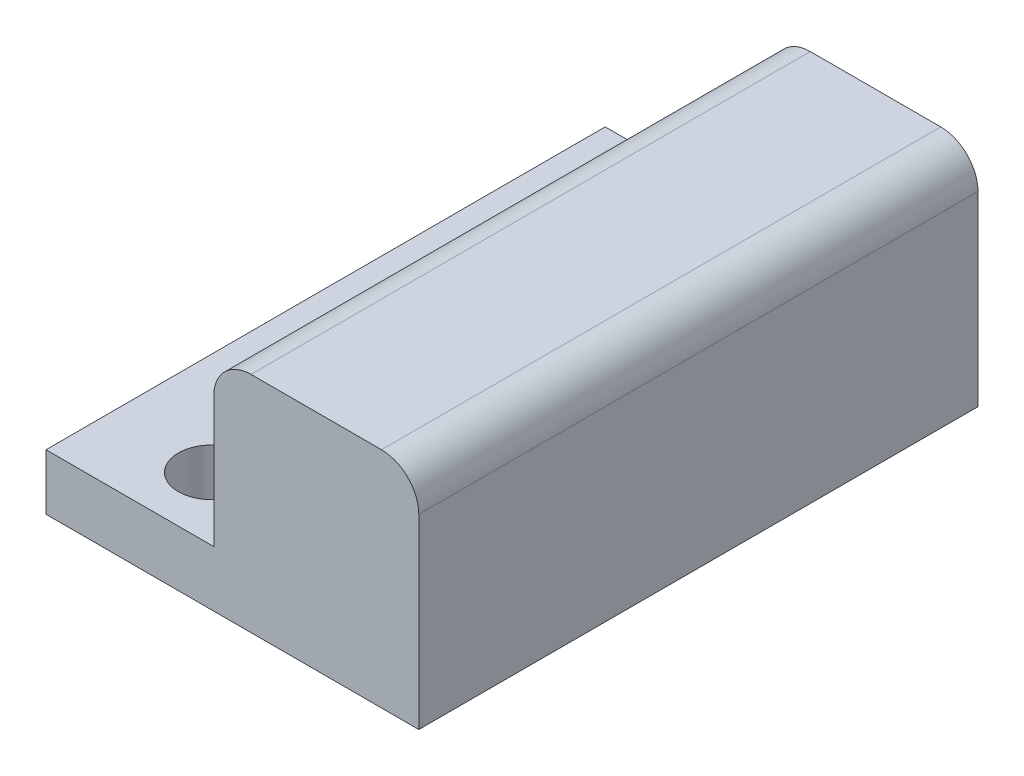
ISO-10303-21;
HEADER;
FILE_DESCRIPTION(('STEP AP214'),'2;1');
FILE_NAME('part.step','',(''),(''),'','','');
FILE_SCHEMA(('AUTOMOTIVE_DESIGN { 1 0 10303 214 1 1 1 1 }'));
ENDSEC;
DATA;
#1=APPLICATION_CONTEXT('core data for automotive mechanical design processes');
#2=APPLICATION_PROTOCOL_DEFINITION('international standard','automotive_design',2000,#1);
#3=PRODUCT_CONTEXT('',#1,'mechanical');
#4=PRODUCT('Part','Part','',(#3));
#5=PRODUCT_RELATED_PRODUCT_CATEGORY('part','',(#4));
#6=PRODUCT_DEFINITION_FORMATION('','',#4);
#7=PRODUCT_DEFINITION_CONTEXT('part definition',#1,'design');
#8=PRODUCT_DEFINITION('design','',#6,#7);
#9=PRODUCT_DEFINITION_SHAPE('','',#8);
#10=(LENGTH_UNIT() NAMED_UNIT(*) SI_UNIT(.MILLI.,.METRE.));
#11=(NAMED_UNIT(*) PLANE_ANGLE_UNIT() SI_UNIT($,.RADIAN.));
#12=(NAMED_UNIT(*) SI_UNIT($,.STERADIAN.) SOLID_ANGLE_UNIT());
#13=UNCERTAINTY_MEASURE_WITH_UNIT(LENGTH_MEASURE(1.E-05),#10,'distance_accuracy_value','');
#14=(GEOMETRIC_REPRESENTATION_CONTEXT(3) GLOBAL_UNCERTAINTY_ASSIGNED_CONTEXT((#13)) GLOBAL_UNIT_ASSIGNED_CONTEXT((#10,
#11,#12)) REPRESENTATION_CONTEXT('',''));
#15=CARTESIAN_POINT('',(0.,0.,0.));
#16=DIRECTION('',(0.,0.,1.));
#17=DIRECTION('',(1.,0.,0.));
#18=AXIS2_PLACEMENT_3D('',#15,#16,#17);
#19=CARTESIAN_POINT('',(10.8430993489864,3.81,0.));
#20=DIRECTION('',(0.,1.,0.));
#21=DIRECTION('',(0.,0.,1.));
#22=AXIS2_PLACEMENT_3D('',#19,#20,#21);
#23=PLANE('',#22);
#24=DIRECTION('',(0.,0.,-1.));
#25=VECTOR('',#24,1.);
#26=CARTESIAN_POINT('',(28.2815496744932,3.81,28.9331090883262));
#27=LINE('',#26,#25);
#28=CARTESIAN_POINT('',(28.2815496744932,3.81,28.9331090883262));
#29=VERTEX_POINT('',#28);
#30=CARTESIAN_POINT('',(28.2815496744932,3.81,-6.62689091167376));
#31=VERTEX_POINT('',#30);
#32=EDGE_CURVE('E197',#29,#31,#27,.T.);
#33=ORIENTED_EDGE('',*,*,#32,.T.);
#34=DIRECTION('',(1.,0.,0.));
#35=VECTOR('',#34,1.);
#36=CARTESIAN_POINT('',(30.8215496744932,3.81,-6.62689091167376));
#37=LINE('',#36,#35);
#38=CARTESIAN_POINT('',(19.3915496744932,3.81,-6.62689091167376));
#39=VERTEX_POINT('',#38);
#40=EDGE_CURVE('E172',#39,#31,#37,.T.);
#41=ORIENTED_EDGE('',*,*,#40,.F.);
#42=DIRECTION('',(0.,0.,1.));
#43=VECTOR('',#42,1.);
#44=CARTESIAN_POINT('',(19.3915496744932,3.81,-6.62689091167376));
#45=LINE('',#44,#43);
#46=CARTESIAN_POINT('',(19.3915496744932,3.81,28.9331090883262));
#47=VERTEX_POINT('',#46);
#48=EDGE_CURVE('E180',#39,#47,#45,.T.);
#49=ORIENTED_EDGE('',*,*,#48,.T.);
#50=DIRECTION('',(1.,0.,0.));
#51=VECTOR('',#50,1.);
#52=CARTESIAN_POINT('',(19.3915496744932,3.81,28.9331090883262));
#53=LINE('',#52,#51);
#54=EDGE_CURVE('E186',#47,#29,#53,.T.);
#55=ORIENTED_EDGE('',*,*,#54,.T.);
#56=EDGE_LOOP('',(#33,#41,#49,#55));
#57=FACE_BOUND('',#56,.T.);
#58=ADVANCED_FACE('F45',(#57),#23,.T.);
#59=DIRECTION('',(0.,0.,-1.));
#60=VECTOR('',#59,1.);
#61=CARTESIAN_POINT('',(16.8515496744932,3.81,31.4731090883262));
#62=LINE('',#61,#60);
#63=CARTESIAN_POINT('',(16.8515496744932,3.81,31.4731090883262));
#64=VERTEX_POINT('',#63);
#65=CARTESIAN_POINT('',(16.8515496744932,3.81,-6.62689091167376));
#66=VERTEX_POINT('',#65);
#67=EDGE_CURVE('E153',#64,#66,#62,.T.);
#68=ORIENTED_EDGE('',*,*,#67,.T.);
#69=CARTESIAN_POINT('',(5.42154967449321,3.81,-6.62689091167375));
#70=VERTEX_POINT('',#69);
#71=EDGE_CURVE('E161',#70,#66,#37,.T.);
#72=ORIENTED_EDGE('',*,*,#71,.F.);
#73=DIRECTION('',(0.,0.,-1.));
#74=VECTOR('',#73,1.);
#75=CARTESIAN_POINT('',(5.42154967449321,3.81,-6.62689091167375));
#76=LINE('',#75,#74);
#77=CARTESIAN_POINT('',(5.42154967449322,3.81,31.4731090883262));
#78=VERTEX_POINT('',#77);
#79=EDGE_CURVE('E233',#78,#70,#76,.T.);
#80=ORIENTED_EDGE('',*,*,#79,.F.);
#81=DIRECTION('',(-1.,0.,0.));
#82=VECTOR('',#81,1.);
#83=CARTESIAN_POINT('',(30.8215496744932,3.81,31.4731090883262));
#84=LINE('',#83,#82);
#85=EDGE_CURVE('E178',#64,#78,#84,.T.);
#86=ORIENTED_EDGE('',*,*,#85,.F.);
#87=EDGE_LOOP('',(#68,#72,#80,#86));
#88=FACE_BOUND('',#87,.T.);
#89=CARTESIAN_POINT('',(9.23154967449321,3.81,-1.41989091167375));
#90=DIRECTION('',(0.,-1.,0.));
#91=DIRECTION('',(0.,0.,1.));
#92=AXIS2_PLACEMENT_3D('',#89,#90,#91);
#93=CIRCLE('',#92,2.286);
#94=CARTESIAN_POINT('',(9.23154967449321,3.81,-3.70589091167375));
#95=VERTEX_POINT('',#94);
#96=EDGE_CURVE('E223',#95,#95,#93,.T.);
#97=ORIENTED_EDGE('',*,*,#96,.T.);
#98=EDGE_LOOP('',(#97));
#99=FACE_BOUND('',#98,.T.);
#100=CARTESIAN_POINT('',(12.4065496744932,3.81,27.1551090883262));
#101=DIRECTION('',(0.,-1.,0.));
#102=DIRECTION('',(0.,0.,1.));
#103=AXIS2_PLACEMENT_3D('',#100,#101,#102);
#104=CIRCLE('',#103,2.286);
#105=CARTESIAN_POINT('',(12.4065496744932,3.81,24.8691090883262));
#106=VERTEX_POINT('',#105);
#107=EDGE_CURVE('E215',#106,#106,#104,.T.);
#108=ORIENTED_EDGE('',*,*,#107,.T.);
#109=EDGE_LOOP('',(#108));
#110=FACE_BOUND('',#109,.T.);
#111=ADVANCED_FACE('F175',(#88,#99,#110),#23,.T.);
#112=CARTESIAN_POINT('',(10.8430993489864,0.,0.));
#113=DIRECTION('',(0.,1.,0.));
#114=DIRECTION('',(0.,0.,1.));
#115=AXIS2_PLACEMENT_3D('',#112,#113,#114);
#116=PLANE('',#115);
#117=DIRECTION('',(0.,0.,1.));
#118=VECTOR('',#117,1.);
#119=CARTESIAN_POINT('',(30.8215496744932,0.,-6.62689091167376));
#120=LINE('',#119,#118);
#121=CARTESIAN_POINT('',(30.8215496744932,0.,-6.62689091167376));
#122=VERTEX_POINT('',#121);
#123=CARTESIAN_POINT('',(30.8215496744932,0.,31.4731090883262));
#124=VERTEX_POINT('',#123);
#125=EDGE_CURVE('E227',#122,#124,#120,.T.);
#126=ORIENTED_EDGE('',*,*,#125,.T.);
#127=DIRECTION('',(-1.,0.,0.));
#128=VECTOR('',#127,1.);
#129=CARTESIAN_POINT('',(30.8215496744932,0.,31.4731090883262));
#130=LINE('',#129,#128);
#131=CARTESIAN_POINT('',(5.42154967449322,0.,31.4731090883262));
#132=VERTEX_POINT('',#131);
#133=EDGE_CURVE('E240',#124,#132,#130,.T.);
#134=ORIENTED_EDGE('',*,*,#133,.T.);
#135=DIRECTION('',(0.,0.,-1.));
#136=VECTOR('',#135,1.);
#137=CARTESIAN_POINT('',(5.42154967449321,0.,-6.62689091167375));
#138=LINE('',#137,#136);
#139=CARTESIAN_POINT('',(5.42154967449321,0.,-6.62689091167375));
#140=VERTEX_POINT('',#139);
#141=EDGE_CURVE('E244',#132,#140,#138,.T.);
#142=ORIENTED_EDGE('',*,*,#141,.T.);
#143=DIRECTION('',(1.,0.,0.));
#144=VECTOR('',#143,1.);
#145=CARTESIAN_POINT('',(30.8215496744932,0.,-6.62689091167376));
#146=LINE('',#145,#144);
#147=EDGE_CURVE('E234',#140,#122,#146,.T.);
#148=ORIENTED_EDGE('',*,*,#147,.T.);
#149=EDGE_LOOP('',(#126,#134,#142,#148));
#150=FACE_BOUND('',#149,.T.);
#151=CARTESIAN_POINT('',(9.23154967449321,0.,-1.41989091167375));
#152=DIRECTION('',(0.,-1.,0.));
#153=DIRECTION('',(0.,0.,1.));
#154=AXIS2_PLACEMENT_3D('',#151,#152,#153);
#155=CIRCLE('',#154,2.286);
#156=CARTESIAN_POINT('',(9.23154967449321,0.,-3.70589091167375));
#157=VERTEX_POINT('',#156);
#158=EDGE_CURVE('E219',#157,#157,#155,.T.);
#159=ORIENTED_EDGE('',*,*,#158,.F.);
#160=EDGE_LOOP('',(#159));
#161=FACE_BOUND('',#160,.T.);
#162=CARTESIAN_POINT('',(12.4065496744932,0.,27.1551090883262));
#163=DIRECTION('',(0.,-1.,0.));
#164=DIRECTION('',(0.,0.,1.));
#165=AXIS2_PLACEMENT_3D('',#162,#163,#164);
#166=CIRCLE('',#165,2.286);
#167=CARTESIAN_POINT('',(12.4065496744932,0.,24.8691090883262));
#168=VERTEX_POINT('',#167);
#169=EDGE_CURVE('E214',#168,#168,#166,.T.);
#170=ORIENTED_EDGE('',*,*,#169,.F.);
#171=EDGE_LOOP('',(#170));
#172=FACE_BOUND('',#171,.T.);
#173=ADVANCED_FACE('F364',(#150,#161,#172),#116,.F.);
#174=CARTESIAN_POINT('',(30.8215496744932,3.81,-6.62689091167376));
#175=DIRECTION('',(-1.,0.,0.));
#176=DIRECTION('',(0.,0.,-1.));
#177=AXIS2_PLACEMENT_3D('',#174,#175,#176);
#178=PLANE('',#177);
#179=DIRECTION('',(0.,-1.,0.));
#180=VECTOR('',#179,1.);
#181=CARTESIAN_POINT('',(30.8215496744932,3.81,31.4731090883262));
#182=LINE('',#181,#180);
#183=CARTESIAN_POINT('',(30.8215496744932,12.7,31.4731090883262));
#184=VERTEX_POINT('',#183);
#185=EDGE_CURVE('E258',#184,#124,#182,.T.);
#186=ORIENTED_EDGE('',*,*,#185,.T.);
#187=ORIENTED_EDGE('',*,*,#125,.F.);
#188=DIRECTION('',(0.,-1.,0.));
#189=VECTOR('',#188,1.);
#190=CARTESIAN_POINT('',(30.8215496744932,3.81,-6.62689091167376));
#191=LINE('',#190,#189);
#192=CARTESIAN_POINT('',(30.8215496744932,12.7,-6.62689091167376));
#193=VERTEX_POINT('',#192);
#194=EDGE_CURVE('E171',#193,#122,#191,.T.);
#195=ORIENTED_EDGE('',*,*,#194,.F.);
#196=DIRECTION('',(0.,0.,1.));
#197=VECTOR('',#196,1.);
#198=CARTESIAN_POINT('',(30.8215496744932,12.7,-6.62689091167376));
#199=LINE('',#198,#197);
#200=EDGE_CURVE('E11',#184,#193,#199,.F.);
#201=ORIENTED_EDGE('',*,*,#200,.F.);
#202=EDGE_LOOP('',(#186,#187,#195,#201));
#203=FACE_BOUND('',#202,.T.);
#204=ADVANCED_FACE('F371',(#203),#178,.F.);
#205=CARTESIAN_POINT('',(30.8215496744932,3.81,31.4731090883262));
#206=DIRECTION('',(0.,0.,-1.));
#207=DIRECTION('',(1.,0.,0.));
#208=AXIS2_PLACEMENT_3D('',#205,#206,#207);
#209=PLANE('',#208);
#210=DIRECTION('',(0.,-1.,0.));
#211=VECTOR('',#210,1.);
#212=CARTESIAN_POINT('',(16.8515496744932,12.7,31.4731090883262));
#213=LINE('',#212,#211);
#214=CARTESIAN_POINT('',(16.8515496744932,12.7,31.4731090883262));
#215=VERTEX_POINT('',#214);
#216=EDGE_CURVE('E157',#215,#64,#213,.T.);
#217=ORIENTED_EDGE('',*,*,#216,.T.);
#218=ORIENTED_EDGE('',*,*,#85,.T.);
#219=DIRECTION('',(0.,-1.,0.));
#220=VECTOR('',#219,1.);
#221=CARTESIAN_POINT('',(5.42154967449322,3.81,31.4731090883262));
#222=LINE('',#221,#220);
#223=EDGE_CURVE('E255',#78,#132,#222,.T.);
#224=ORIENTED_EDGE('',*,*,#223,.T.);
#225=ORIENTED_EDGE('',*,*,#133,.F.);
#226=ORIENTED_EDGE('',*,*,#185,.F.);
#227=CARTESIAN_POINT('',(28.2815496744932,12.7,31.4731090883262));
#228=DIRECTION('',(0.,0.,1.));
#229=DIRECTION('',(1.,0.,0.));
#230=AXIS2_PLACEMENT_3D('',#227,#228,#229);
#231=CIRCLE('',#230,2.54);
#232=CARTESIAN_POINT('',(28.2815496744932,15.24,31.4731090883262));
#233=VERTEX_POINT('',#232);
#234=EDGE_CURVE('E60',#233,#184,#231,.F.);
#235=ORIENTED_EDGE('',*,*,#234,.F.);
#236=DIRECTION('',(-1.,0.,0.));
#237=VECTOR('',#236,1.);
#238=CARTESIAN_POINT('',(30.8215496744932,15.24,31.4731090883262));
#239=LINE('',#238,#237);
#240=CARTESIAN_POINT('',(19.3915496744932,15.24,31.4731090883262));
#241=VERTEX_POINT('',#240);
#242=EDGE_CURVE('E188',#233,#241,#239,.T.);
#243=ORIENTED_EDGE('',*,*,#242,.T.);
#244=CARTESIAN_POINT('',(19.3915496744932,12.7,31.4731090883262));
#245=DIRECTION('',(0.,0.,1.));
#246=DIRECTION('',(1.,0.,0.));
#247=AXIS2_PLACEMENT_3D('',#244,#245,#246);
#248=CIRCLE('',#247,2.54);
#249=EDGE_CURVE('E54',#215,#241,#248,.F.);
#250=ORIENTED_EDGE('',*,*,#249,.F.);
#251=EDGE_LOOP('',(#217,#218,#224,#225,#226,#235,#243,#250));
#252=FACE_BOUND('',#251,.T.);
#253=ADVANCED_FACE('F309',(#252),#209,.F.);
#254=CARTESIAN_POINT('',(5.42154967449321,3.81,-6.62689091167375));
#255=DIRECTION('',(1.,0.,0.));
#256=DIRECTION('',(0.,0.,1.));
#257=AXIS2_PLACEMENT_3D('',#254,#255,#256);
#258=PLANE('',#257);
#259=ORIENTED_EDGE('',*,*,#141,.F.);
#260=ORIENTED_EDGE('',*,*,#223,.F.);
#261=ORIENTED_EDGE('',*,*,#79,.T.);
#262=DIRECTION('',(0.,-1.,0.));
#263=VECTOR('',#262,1.);
#264=CARTESIAN_POINT('',(5.42154967449321,3.81,-6.62689091167375));
#265=LINE('',#264,#263);
#266=EDGE_CURVE('E166',#70,#140,#265,.T.);
#267=ORIENTED_EDGE('',*,*,#266,.T.);
#268=EDGE_LOOP('',(#259,#260,#261,#267));
#269=FACE_BOUND('',#268,.T.);
#270=ADVANCED_FACE('F375',(#269),#258,.F.);
#271=CARTESIAN_POINT('',(30.8215496744932,3.81,-6.62689091167376));
#272=DIRECTION('',(0.,0.,1.));
#273=DIRECTION('',(-1.,0.,0.));
#274=AXIS2_PLACEMENT_3D('',#271,#272,#273);
#275=PLANE('',#274);
#276=DIRECTION('',(1.,0.,0.));
#277=VECTOR('',#276,1.);
#278=CARTESIAN_POINT('',(30.8215496744932,15.24,-6.62689091167376));
#279=LINE('',#278,#277);
#280=CARTESIAN_POINT('',(19.3915496744932,15.24,-6.62689091167376));
#281=VERTEX_POINT('',#280);
#282=CARTESIAN_POINT('',(28.2815496744932,15.24,-6.62689091167376));
#283=VERTEX_POINT('',#282);
#284=EDGE_CURVE('E181',#281,#283,#279,.T.);
#285=ORIENTED_EDGE('',*,*,#284,.T.);
#286=CARTESIAN_POINT('',(28.2815496744932,12.7,-6.62689091167376));
#287=DIRECTION('',(0.,0.,-1.));
#288=DIRECTION('',(-1.,0.,0.));
#289=AXIS2_PLACEMENT_3D('',#286,#287,#288);
#290=CIRCLE('',#289,2.54);
#291=EDGE_CURVE('E294',#193,#283,#290,.F.);
#292=ORIENTED_EDGE('',*,*,#291,.F.);
#293=ORIENTED_EDGE('',*,*,#194,.T.);
#294=ORIENTED_EDGE('',*,*,#147,.F.);
#295=ORIENTED_EDGE('',*,*,#266,.F.);
#296=ORIENTED_EDGE('',*,*,#71,.T.);
#297=DIRECTION('',(0.,-1.,0.));
#298=VECTOR('',#297,1.);
#299=CARTESIAN_POINT('',(16.8515496744932,12.7,-6.62689091167376));
#300=LINE('',#299,#298);
#301=CARTESIAN_POINT('',(16.8515496744932,12.7,-6.62689091167376));
#302=VERTEX_POINT('',#301);
#303=EDGE_CURVE('E148',#302,#66,#300,.T.);
#304=ORIENTED_EDGE('',*,*,#303,.F.);
#305=CARTESIAN_POINT('',(19.3915496744932,12.7,-6.62689091167376));
#306=DIRECTION('',(0.,0.,-1.));
#307=DIRECTION('',(-1.,0.,0.));
#308=AXIS2_PLACEMENT_3D('',#305,#306,#307);
#309=CIRCLE('',#308,2.54);
#310=EDGE_CURVE('E298',#281,#302,#309,.F.);
#311=ORIENTED_EDGE('',*,*,#310,.F.);
#312=EDGE_LOOP('',(#285,#292,#293,#294,#295,#296,#304,#311));
#313=FACE_BOUND('',#312,.T.);
#314=DIRECTION('',(0.,-1.,0.));
#315=VECTOR('',#314,1.);
#316=CARTESIAN_POINT('',(19.3915496744932,12.7,-6.62689091167376));
#317=LINE('',#316,#315);
#318=CARTESIAN_POINT('',(19.3915496744932,11.43,-6.62689091167376));
#319=VERTEX_POINT('',#318);
#320=EDGE_CURVE('E158',#319,#39,#317,.T.);
#321=ORIENTED_EDGE('',*,*,#320,.T.);
#322=ORIENTED_EDGE('',*,*,#40,.T.);
#323=DIRECTION('',(0.,-1.,0.));
#324=VECTOR('',#323,1.);
#325=CARTESIAN_POINT('',(28.2815496744932,12.7,-6.62689091167376));
#326=LINE('',#325,#324);
#327=CARTESIAN_POINT('',(28.2815496744932,11.43,-6.62689091167376));
#328=VERTEX_POINT('',#327);
#329=EDGE_CURVE('E201',#328,#31,#326,.T.);
#330=ORIENTED_EDGE('',*,*,#329,.F.);
#331=DIRECTION('',(-0.707106781186551,0.707106781186544,0.));
#332=VECTOR('',#331,1.);
#333=CARTESIAN_POINT('',(33.3615496744932,6.35000000000004,-6.62689091167376));
#334=LINE('',#333,#332);
#335=CARTESIAN_POINT('',(27.0115496744932,12.7,-6.62689091167376));
#336=VERTEX_POINT('',#335);
#337=EDGE_CURVE('E284',#336,#328,#334,.F.);
#338=ORIENTED_EDGE('',*,*,#337,.F.);
#339=DIRECTION('',(1.,0.,0.));
#340=VECTOR('',#339,1.);
#341=CARTESIAN_POINT('',(30.8215496744932,12.7,-6.62689091167376));
#342=LINE('',#341,#340);
#343=CARTESIAN_POINT('',(20.6615496744932,12.7,-6.62689091167376));
#344=VERTEX_POINT('',#343);
#345=EDGE_CURVE('E313',#344,#336,#342,.T.);
#346=ORIENTED_EDGE('',*,*,#345,.F.);
#347=DIRECTION('',(-0.707106781186551,-0.707106781186544,0.));
#348=VECTOR('',#347,1.);
#349=CARTESIAN_POINT('',(21.2965496744933,13.335,-6.62689091167376));
#350=LINE('',#349,#348);
#351=EDGE_CURVE('E280',#319,#344,#350,.F.);
#352=ORIENTED_EDGE('',*,*,#351,.F.);
#353=EDGE_LOOP('',(#321,#322,#330,#338,#346,#352));
#354=FACE_BOUND('',#353,.T.);
#355=ADVANCED_FACE('F163',(#313,#354),#275,.F.);
#356=CARTESIAN_POINT('',(9.23154967449321,3.81,-1.41989091167375));
#357=DIRECTION('',(0.,-1.,0.));
#358=DIRECTION('',(0.,0.,-1.));
#359=AXIS2_PLACEMENT_3D('',#356,#357,#358);
#360=CYLINDRICAL_SURFACE('',#359,2.286);
#361=CARTESIAN_POINT('',(9.23154967449321,3.81,-3.70589091167375));
#362=CARTESIAN_POINT('',(9.23154967449321,3.7703125,-3.70589091167375));
#363=CARTESIAN_POINT('',(9.23154967449321,3.730625,-3.70589091167375));
#364=CARTESIAN_POINT('',(9.23154967449321,3.65125,-3.70589091167375));
#365=CARTESIAN_POINT('',(9.23154967449321,3.6115625,-3.70589091167375));
#366=CARTESIAN_POINT('',(9.23154967449321,3.5321875,-3.70589091167375));
#367=CARTESIAN_POINT('',(9.23154967449321,3.4925,-3.70589091167375));
#368=CARTESIAN_POINT('',(9.23154967449321,3.413125,-3.70589091167375));
#369=CARTESIAN_POINT('',(9.23154967449321,3.3734375,-3.70589091167375));
#370=CARTESIAN_POINT('',(9.23154967449321,3.2940625,-3.70589091167375));
#371=CARTESIAN_POINT('',(9.23154967449321,3.254375,-3.70589091167375));
#372=CARTESIAN_POINT('',(9.23154967449321,3.175,-3.70589091167375));
#373=CARTESIAN_POINT('',(9.23154967449321,3.1353125,-3.70589091167375));
#374=CARTESIAN_POINT('',(9.23154967449321,3.0559375,-3.70589091167375));
#375=CARTESIAN_POINT('',(9.23154967449321,3.01625,-3.70589091167375));
#376=CARTESIAN_POINT('',(9.23154967449321,2.936875,-3.70589091167375));
#377=CARTESIAN_POINT('',(9.23154967449321,2.8971875,-3.70589091167375));
#378=CARTESIAN_POINT('',(9.23154967449321,2.8178125,-3.70589091167375));
#379=CARTESIAN_POINT('',(9.23154967449321,2.778125,-3.70589091167375));
#380=CARTESIAN_POINT('',(9.23154967449321,2.69875,-3.70589091167375));
#381=CARTESIAN_POINT('',(9.23154967449321,2.6590625,-3.70589091167375));
#382=CARTESIAN_POINT('',(9.23154967449321,2.5796875,-3.70589091167375));
#383=CARTESIAN_POINT('',(9.23154967449321,2.54,-3.70589091167375));
#384=CARTESIAN_POINT('',(9.23154967449321,2.460625,-3.70589091167375));
#385=CARTESIAN_POINT('',(9.23154967449321,2.4209375,-3.70589091167375));
#386=CARTESIAN_POINT('',(9.23154967449321,2.3415625,-3.70589091167375));
#387=CARTESIAN_POINT('',(9.23154967449321,2.301875,-3.70589091167375));
#388=CARTESIAN_POINT('',(9.23154967449321,2.2225,-3.70589091167375));
#389=CARTESIAN_POINT('',(9.23154967449321,2.1828125,-3.70589091167375));
#390=CARTESIAN_POINT('',(9.23154967449321,2.1034375,-3.70589091167375));
#391=CARTESIAN_POINT('',(9.23154967449321,2.06375,-3.70589091167375));
#392=CARTESIAN_POINT('',(9.23154967449321,1.984375,-3.70589091167375));
#393=CARTESIAN_POINT('',(9.23154967449321,1.9446875,-3.70589091167375));
#394=CARTESIAN_POINT('',(9.23154967449321,1.8653125,-3.70589091167375));
#395=CARTESIAN_POINT('',(9.23154967449321,1.825625,-3.70589091167375));
#396=CARTESIAN_POINT('',(9.23154967449321,1.74625,-3.70589091167375));
#397=CARTESIAN_POINT('',(9.23154967449321,1.7065625,-3.70589091167375));
#398=CARTESIAN_POINT('',(9.23154967449321,1.6271875,-3.70589091167375));
#399=CARTESIAN_POINT('',(9.23154967449321,1.5875,-3.70589091167375));
#400=CARTESIAN_POINT('',(9.23154967449321,1.508125,-3.70589091167375));
#401=CARTESIAN_POINT('',(9.23154967449321,1.4684375,-3.70589091167375));
#402=CARTESIAN_POINT('',(9.23154967449321,1.3890625,-3.70589091167375));
#403=CARTESIAN_POINT('',(9.23154967449321,1.349375,-3.70589091167375));
#404=CARTESIAN_POINT('',(9.23154967449321,1.27,-3.70589091167375));
#405=CARTESIAN_POINT('',(9.23154967449321,1.2303125,-3.70589091167375));
#406=CARTESIAN_POINT('',(9.23154967449321,1.1509375,-3.70589091167375));
#407=CARTESIAN_POINT('',(9.23154967449321,1.11125,-3.70589091167375));
#408=CARTESIAN_POINT('',(9.23154967449321,1.031875,-3.70589091167375));
#409=CARTESIAN_POINT('',(9.23154967449321,0.9921875,-3.70589091167375));
#410=CARTESIAN_POINT('',(9.23154967449321,0.9128125,-3.70589091167375));
#411=CARTESIAN_POINT('',(9.23154967449321,0.873125,-3.70589091167375));
#412=CARTESIAN_POINT('',(9.23154967449321,0.79375,-3.70589091167375));
#413=CARTESIAN_POINT('',(9.23154967449321,0.7540625,-3.70589091167375));
#414=CARTESIAN_POINT('',(9.23154967449321,0.6746875,-3.70589091167375));
#415=CARTESIAN_POINT('',(9.23154967449321,0.635,-3.70589091167375));
#416=CARTESIAN_POINT('',(9.23154967449321,0.555625,-3.70589091167375));
#417=CARTESIAN_POINT('',(9.23154967449321,0.5159375,-3.70589091167375));
#418=CARTESIAN_POINT('',(9.23154967449321,0.4365625,-3.70589091167375));
#419=CARTESIAN_POINT('',(9.23154967449321,0.396875,-3.70589091167375));
#420=CARTESIAN_POINT('',(9.23154967449321,0.3175,-3.70589091167375));
#421=CARTESIAN_POINT('',(9.23154967449321,0.2778125,-3.70589091167375));
#422=CARTESIAN_POINT('',(9.23154967449321,0.1984375,-3.70589091167375));
#423=CARTESIAN_POINT('',(9.23154967449321,0.15875,-3.70589091167375));
#424=CARTESIAN_POINT('',(9.23154967449321,0.0793749999999999,-3.70589091167375));
#425=CARTESIAN_POINT('',(9.23154967449321,0.0396874999999999,-3.70589091167375));
#426=CARTESIAN_POINT('',(9.23154967449321,0.,-3.70589091167375));
#427=B_SPLINE_CURVE_WITH_KNOTS('',3,(#361,#362,#363,#364,#365,#366,#367,#368,#369,#370,#371,
#372,#373,#374,#375,#376,#377,#378,#379,#380,#381,#382,#383,#384,#385,#386,#387,#388,#389,#390,
#391,#392,#393,#394,#395,#396,#397,#398,#399,#400,#401,#402,#403,#404,#405,#406,#407,#408,#409,
#410,#411,#412,#413,#414,#415,#416,#417,#418,#419,#420,#421,#422,#423,#424,#425,#426),
.UNSPECIFIED.,.F.,.F.,(4,2,2,2,2,2,2,2,2,2,2,2,2,2,2,2,2,2,2,2,2,2,2,2,2,2,2,2,2,2,2,2,4),(0.,
0.1190625,0.238125,0.3571875,0.47625,0.5953125,0.714375,0.833437499999999,0.9525,1.0715625,
1.190625,1.3096875,1.42875,1.5478125,1.666875,1.7859375,1.905,2.0240625,2.143125,2.2621875,
2.38125,2.5003125,2.619375,2.7384375,2.8575,2.9765625,3.095625,3.2146875,3.33375,3.4528125,
3.571875,3.6909375,3.81),.UNSPECIFIED.);
#428=EDGE_CURVE('BSEAM367',#95,#157,#427,.T.);
#429=ORIENTED_EDGE('',*,*,#96,.F.);
#430=ORIENTED_EDGE('',*,*,#158,.T.);
#431=ORIENTED_EDGE('',*,*,#428,.T.);
#432=ORIENTED_EDGE('',*,*,#428,.F.);
#433=EDGE_LOOP('',(#429,#431,#430,#432));
#434=FACE_BOUND('',#433,.T.);
#435=ADVANCED_FACE('F367',(#434),#360,.F.);
#436=CARTESIAN_POINT('',(12.4065496744932,3.81,27.1551090883262));
#437=DIRECTION('',(0.,-1.,0.));
#438=DIRECTION('',(0.,0.,-1.));
#439=AXIS2_PLACEMENT_3D('',#436,#437,#438);
#440=CYLINDRICAL_SURFACE('',#439,2.286);
#441=CARTESIAN_POINT('',(12.4065496744932,3.81,24.8691090883262));
#442=CARTESIAN_POINT('',(12.4065496744932,3.7703125,24.8691090883262));
#443=CARTESIAN_POINT('',(12.4065496744932,3.730625,24.8691090883262));
#444=CARTESIAN_POINT('',(12.4065496744932,3.65125,24.8691090883262));
#445=CARTESIAN_POINT('',(12.4065496744932,3.6115625,24.8691090883262));
#446=CARTESIAN_POINT('',(12.4065496744932,3.5321875,24.8691090883262));
#447=CARTESIAN_POINT('',(12.4065496744932,3.4925,24.8691090883262));
#448=CARTESIAN_POINT('',(12.4065496744932,3.413125,24.8691090883262));
#449=CARTESIAN_POINT('',(12.4065496744932,3.3734375,24.8691090883262));
#450=CARTESIAN_POINT('',(12.4065496744932,3.2940625,24.8691090883262));
#451=CARTESIAN_POINT('',(12.4065496744932,3.254375,24.8691090883262));
#452=CARTESIAN_POINT('',(12.4065496744932,3.175,24.8691090883262));
#453=CARTESIAN_POINT('',(12.4065496744932,3.1353125,24.8691090883262));
#454=CARTESIAN_POINT('',(12.4065496744932,3.0559375,24.8691090883262));
#455=CARTESIAN_POINT('',(12.4065496744932,3.01625,24.8691090883262));
#456=CARTESIAN_POINT('',(12.4065496744932,2.936875,24.8691090883262));
#457=CARTESIAN_POINT('',(12.4065496744932,2.8971875,24.8691090883262));
#458=CARTESIAN_POINT('',(12.4065496744932,2.8178125,24.8691090883262));
#459=CARTESIAN_POINT('',(12.4065496744932,2.778125,24.8691090883262));
#460=CARTESIAN_POINT('',(12.4065496744932,2.69875,24.8691090883262));
#461=CARTESIAN_POINT('',(12.4065496744932,2.6590625,24.8691090883262));
#462=CARTESIAN_POINT('',(12.4065496744932,2.5796875,24.8691090883262));
#463=CARTESIAN_POINT('',(12.4065496744932,2.54,24.8691090883262));
#464=CARTESIAN_POINT('',(12.4065496744932,2.460625,24.8691090883262));
#465=CARTESIAN_POINT('',(12.4065496744932,2.4209375,24.8691090883262));
#466=CARTESIAN_POINT('',(12.4065496744932,2.3415625,24.8691090883262));
#467=CARTESIAN_POINT('',(12.4065496744932,2.301875,24.8691090883262));
#468=CARTESIAN_POINT('',(12.4065496744932,2.2225,24.8691090883262));
#469=CARTESIAN_POINT('',(12.4065496744932,2.1828125,24.8691090883262));
#470=CARTESIAN_POINT('',(12.4065496744932,2.1034375,24.8691090883262));
#471=CARTESIAN_POINT('',(12.4065496744932,2.06375,24.8691090883262));
#472=CARTESIAN_POINT('',(12.4065496744932,1.984375,24.8691090883262));
#473=CARTESIAN_POINT('',(12.4065496744932,1.9446875,24.8691090883262));
#474=CARTESIAN_POINT('',(12.4065496744932,1.8653125,24.8691090883262));
#475=CARTESIAN_POINT('',(12.4065496744932,1.825625,24.8691090883262));
#476=CARTESIAN_POINT('',(12.4065496744932,1.74625,24.8691090883262));
#477=CARTESIAN_POINT('',(12.4065496744932,1.7065625,24.8691090883262));
#478=CARTESIAN_POINT('',(12.4065496744932,1.6271875,24.8691090883262));
#479=CARTESIAN_POINT('',(12.4065496744932,1.5875,24.8691090883262));
#480=CARTESIAN_POINT('',(12.4065496744932,1.508125,24.8691090883262));
#481=CARTESIAN_POINT('',(12.4065496744932,1.4684375,24.8691090883262));
#482=CARTESIAN_POINT('',(12.4065496744932,1.3890625,24.8691090883262));
#483=CARTESIAN_POINT('',(12.4065496744932,1.349375,24.8691090883262));
#484=CARTESIAN_POINT('',(12.4065496744932,1.27,24.8691090883262));
#485=CARTESIAN_POINT('',(12.4065496744932,1.2303125,24.8691090883262));
#486=CARTESIAN_POINT('',(12.4065496744932,1.1509375,24.8691090883262));
#487=CARTESIAN_POINT('',(12.4065496744932,1.11125,24.8691090883262));
#488=CARTESIAN_POINT('',(12.4065496744932,1.031875,24.8691090883262));
#489=CARTESIAN_POINT('',(12.4065496744932,0.9921875,24.8691090883262));
#490=CARTESIAN_POINT('',(12.4065496744932,0.9128125,24.8691090883262));
#491=CARTESIAN_POINT('',(12.4065496744932,0.873125,24.8691090883262));
#492=CARTESIAN_POINT('',(12.4065496744932,0.79375,24.8691090883262));
#493=CARTESIAN_POINT('',(12.4065496744932,0.7540625,24.8691090883262));
#494=CARTESIAN_POINT('',(12.4065496744932,0.6746875,24.8691090883262));
#495=CARTESIAN_POINT('',(12.4065496744932,0.635,24.8691090883262));
#496=CARTESIAN_POINT('',(12.4065496744932,0.555625,24.8691090883262));
#497=CARTESIAN_POINT('',(12.4065496744932,0.5159375,24.8691090883262));
#498=CARTESIAN_POINT('',(12.4065496744932,0.4365625,24.8691090883262));
#499=CARTESIAN_POINT('',(12.4065496744932,0.396875,24.8691090883262));
#500=CARTESIAN_POINT('',(12.4065496744932,0.3175,24.8691090883262));
#501=CARTESIAN_POINT('',(12.4065496744932,0.2778125,24.8691090883262));
#502=CARTESIAN_POINT('',(12.4065496744932,0.1984375,24.8691090883262));
#503=CARTESIAN_POINT('',(12.4065496744932,0.15875,24.8691090883262));
#504=CARTESIAN_POINT('',(12.4065496744932,0.0793749999999999,24.8691090883262));
#505=CARTESIAN_POINT('',(12.4065496744932,0.0396874999999999,24.8691090883262));
#506=CARTESIAN_POINT('',(12.4065496744932,0.,24.8691090883262));
#507=B_SPLINE_CURVE_WITH_KNOTS('',3,(#441,#442,#443,#444,#445,#446,#447,#448,#449,#450,#451,
#452,#453,#454,#455,#456,#457,#458,#459,#460,#461,#462,#463,#464,#465,#466,#467,#468,#469,#470,
#471,#472,#473,#474,#475,#476,#477,#478,#479,#480,#481,#482,#483,#484,#485,#486,#487,#488,#489,
#490,#491,#492,#493,#494,#495,#496,#497,#498,#499,#500,#501,#502,#503,#504,#505,#506),
.UNSPECIFIED.,.F.,.F.,(4,2,2,2,2,2,2,2,2,2,2,2,2,2,2,2,2,2,2,2,2,2,2,2,2,2,2,2,2,2,2,2,4),(0.,
0.1190625,0.238125,0.3571875,0.47625,0.5953125,0.714375,0.833437499999999,0.9525,1.0715625,
1.190625,1.3096875,1.42875,1.5478125,1.666875,1.7859375,1.905,2.0240625,2.143125,2.2621875,
2.38125,2.5003125,2.619375,2.7384375,2.8575,2.9765625,3.095625,3.2146875,3.33375,3.4528125,
3.571875,3.6909375,3.81),.UNSPECIFIED.);
#508=EDGE_CURVE('BSEAM458',#106,#168,#507,.T.);
#509=ORIENTED_EDGE('',*,*,#107,.F.);
#510=ORIENTED_EDGE('',*,*,#169,.T.);
#511=ORIENTED_EDGE('',*,*,#508,.T.);
#512=ORIENTED_EDGE('',*,*,#508,.F.);
#513=EDGE_LOOP('',(#509,#511,#510,#512));
#514=FACE_BOUND('',#513,.T.);
#515=ADVANCED_FACE('F458',(#514),#440,.F.);
#516=CARTESIAN_POINT('',(16.8515496744932,12.7,31.4731090883262));
#517=DIRECTION('',(1.,0.,0.));
#518=DIRECTION('',(0.,0.,1.));
#519=AXIS2_PLACEMENT_3D('',#516,#517,#518);
#520=PLANE('',#519);
#521=ORIENTED_EDGE('',*,*,#303,.T.);
#522=ORIENTED_EDGE('',*,*,#67,.F.);
#523=ORIENTED_EDGE('',*,*,#216,.F.);
#524=DIRECTION('',(0.,0.,-1.));
#525=VECTOR('',#524,1.);
#526=CARTESIAN_POINT('',(16.8515496744932,12.7,31.4731090883262));
#527=LINE('',#526,#525);
#528=EDGE_CURVE('E68',#302,#215,#527,.F.);
#529=ORIENTED_EDGE('',*,*,#528,.F.);
#530=EDGE_LOOP('',(#521,#522,#523,#529));
#531=FACE_BOUND('',#530,.T.);
#532=ADVANCED_FACE('F150',(#531),#520,.F.);
#533=CARTESIAN_POINT('',(19.3915496744932,12.7,-6.62689091167376));
#534=DIRECTION('',(-1.,0.,0.));
#535=DIRECTION('',(0.,0.,-1.));
#536=AXIS2_PLACEMENT_3D('',#533,#534,#535);
#537=PLANE('',#536);
#538=DIRECTION('',(0.,-1.,0.));
#539=VECTOR('',#538,1.);
#540=CARTESIAN_POINT('',(19.3915496744932,12.7,28.9331090883262));
#541=LINE('',#540,#539);
#542=CARTESIAN_POINT('',(19.3915496744932,11.43,28.9331090883262));
#543=VERTEX_POINT('',#542);
#544=EDGE_CURVE('E207',#543,#47,#541,.T.);
#545=ORIENTED_EDGE('',*,*,#544,.T.);
#546=ORIENTED_EDGE('',*,*,#48,.F.);
#547=ORIENTED_EDGE('',*,*,#320,.F.);
#548=DIRECTION('',(0.,0.,-1.));
#549=VECTOR('',#548,1.);
#550=CARTESIAN_POINT('',(19.3915496744932,11.43,-6.62689091167376));
#551=LINE('',#550,#549);
#552=EDGE_CURVE('E274',#543,#319,#551,.T.);
#553=ORIENTED_EDGE('',*,*,#552,.F.);
#554=EDGE_LOOP('',(#545,#546,#547,#553));
#555=FACE_BOUND('',#554,.T.);
#556=ADVANCED_FACE('F345',(#555),#537,.F.);
#557=CARTESIAN_POINT('',(19.3915496744932,12.7,28.9331090883262));
#558=DIRECTION('',(0.,0.,1.));
#559=DIRECTION('',(-1.,0.,0.));
#560=AXIS2_PLACEMENT_3D('',#557,#558,#559);
#561=PLANE('',#560);
#562=DIRECTION('',(1.,0.,0.));
#563=VECTOR('',#562,1.);
#564=CARTESIAN_POINT('',(19.3915496744932,12.7,28.9331090883262));
#565=LINE('',#564,#563);
#566=CARTESIAN_POINT('',(20.6615496744932,12.7,28.9331090883262));
#567=VERTEX_POINT('',#566);
#568=CARTESIAN_POINT('',(27.0115496744932,12.7,28.9331090883262));
#569=VERTEX_POINT('',#568);
#570=EDGE_CURVE('E191',#567,#569,#565,.T.);
#571=ORIENTED_EDGE('',*,*,#570,.T.);
#572=DIRECTION('',(0.707106781186551,-0.707106781186544,0.));
#573=VECTOR('',#572,1.);
#574=CARTESIAN_POINT('',(27.0115496744932,12.7,28.9331090883262));
#575=LINE('',#574,#573);
#576=CARTESIAN_POINT('',(28.2815496744932,11.43,28.9331090883262));
#577=VERTEX_POINT('',#576);
#578=EDGE_CURVE('E267',#577,#569,#575,.F.);
#579=ORIENTED_EDGE('',*,*,#578,.F.);
#580=DIRECTION('',(0.,-1.,0.));
#581=VECTOR('',#580,1.);
#582=CARTESIAN_POINT('',(28.2815496744932,12.7,28.9331090883262));
#583=LINE('',#582,#581);
#584=EDGE_CURVE('E204',#577,#29,#583,.T.);
#585=ORIENTED_EDGE('',*,*,#584,.T.);
#586=ORIENTED_EDGE('',*,*,#54,.F.);
#587=ORIENTED_EDGE('',*,*,#544,.F.);
#588=DIRECTION('',(0.707106781186551,0.707106781186544,0.));
#589=VECTOR('',#588,1.);
#590=CARTESIAN_POINT('',(20.6615496744932,12.7,28.9331090883262));
#591=LINE('',#590,#589);
#592=EDGE_CURVE('E271',#567,#543,#591,.F.);
#593=ORIENTED_EDGE('',*,*,#592,.F.);
#594=EDGE_LOOP('',(#571,#579,#585,#586,#587,#593));
#595=FACE_BOUND('',#594,.T.);
#596=ADVANCED_FACE('F332',(#595),#561,.F.);
#597=CARTESIAN_POINT('',(28.2815496744932,12.7,28.9331090883262));
#598=DIRECTION('',(1.,0.,0.));
#599=DIRECTION('',(0.,0.,1.));
#600=AXIS2_PLACEMENT_3D('',#597,#598,#599);
#601=PLANE('',#600);
#602=ORIENTED_EDGE('',*,*,#329,.T.);
#603=ORIENTED_EDGE('',*,*,#32,.F.);
#604=ORIENTED_EDGE('',*,*,#584,.F.);
#605=DIRECTION('',(0.,0.,1.));
#606=VECTOR('',#605,1.);
#607=CARTESIAN_POINT('',(28.2815496744932,11.43,28.9331090883262));
#608=LINE('',#607,#606);
#609=EDGE_CURVE('E277',#328,#577,#608,.T.);
#610=ORIENTED_EDGE('',*,*,#609,.F.);
#611=EDGE_LOOP('',(#602,#603,#604,#610));
#612=FACE_BOUND('',#611,.T.);
#613=ADVANCED_FACE('F343',(#612),#601,.F.);
#614=CARTESIAN_POINT('',(10.8430993489864,12.7,0.));
#615=DIRECTION('',(0.,1.,0.));
#616=DIRECTION('',(0.,0.,1.));
#617=AXIS2_PLACEMENT_3D('',#614,#615,#616);
#618=PLANE('',#617);
#619=ORIENTED_EDGE('',*,*,#345,.T.);
#620=DIRECTION('',(0.,0.,-1.));
#621=VECTOR('',#620,1.);
#622=CARTESIAN_POINT('',(27.0115496744932,12.7,-6.62689091167376));
#623=LINE('',#622,#621);
#624=EDGE_CURVE('E261',#569,#336,#623,.T.);
#625=ORIENTED_EDGE('',*,*,#624,.F.);
#626=ORIENTED_EDGE('',*,*,#570,.F.);
#627=DIRECTION('',(0.,0.,1.));
#628=VECTOR('',#627,1.);
#629=CARTESIAN_POINT('',(20.6615496744932,12.7,28.9331090883262));
#630=LINE('',#629,#628);
#631=EDGE_CURVE('E264',#344,#567,#630,.T.);
#632=ORIENTED_EDGE('',*,*,#631,.F.);
#633=EDGE_LOOP('',(#619,#625,#626,#632));
#634=FACE_BOUND('',#633,.T.);
#635=ADVANCED_FACE('F320',(#634),#618,.F.);
#636=CARTESIAN_POINT('',(10.8430993489864,15.24,0.));
#637=DIRECTION('',(0.,1.,0.));
#638=DIRECTION('',(0.,0.,1.));
#639=AXIS2_PLACEMENT_3D('',#636,#637,#638);
#640=PLANE('',#639);
#641=ORIENTED_EDGE('',*,*,#242,.F.);
#642=DIRECTION('',(0.,0.,1.));
#643=VECTOR('',#642,1.);
#644=CARTESIAN_POINT('',(28.2815496744932,15.24,31.4731090883262));
#645=LINE('',#644,#643);
#646=EDGE_CURVE('E288',#283,#233,#645,.T.);
#647=ORIENTED_EDGE('',*,*,#646,.F.);
#648=ORIENTED_EDGE('',*,*,#284,.F.);
#649=DIRECTION('',(0.,0.,-1.));
#650=VECTOR('',#649,1.);
#651=CARTESIAN_POINT('',(19.3915496744932,15.24,-6.62689091167376));
#652=LINE('',#651,#650);
#653=EDGE_CURVE('E291',#241,#281,#652,.T.);
#654=ORIENTED_EDGE('',*,*,#653,.F.);
#655=EDGE_LOOP('',(#641,#647,#648,#654));
#656=FACE_BOUND('',#655,.T.);
#657=ADVANCED_FACE('F350',(#656),#640,.T.);
#658=CARTESIAN_POINT('',(20.6615496744932,12.7,0.));
#659=DIRECTION('',(0.707106781186544,-0.707106781186551,0.));
#660=DIRECTION('',(0.,0.,-1.));
#661=AXIS2_PLACEMENT_3D('',#658,#659,#660);
#662=PLANE('',#661);
#663=ORIENTED_EDGE('',*,*,#351,.T.);
#664=ORIENTED_EDGE('',*,*,#631,.T.);
#665=ORIENTED_EDGE('',*,*,#592,.T.);
#666=ORIENTED_EDGE('',*,*,#552,.T.);
#667=EDGE_LOOP('',(#663,#664,#665,#666));
#668=FACE_BOUND('',#667,.T.);
#669=ADVANCED_FACE('F348',(#668),#662,.T.);
#670=CARTESIAN_POINT('',(27.0115496744932,12.7,0.));
#671=DIRECTION('',(-0.707106781186544,-0.707106781186551,0.));
#672=DIRECTION('',(0.,0.,1.));
#673=AXIS2_PLACEMENT_3D('',#670,#671,#672);
#674=PLANE('',#673);
#675=ORIENTED_EDGE('',*,*,#578,.T.);
#676=ORIENTED_EDGE('',*,*,#624,.T.);
#677=ORIENTED_EDGE('',*,*,#337,.T.);
#678=ORIENTED_EDGE('',*,*,#609,.T.);
#679=EDGE_LOOP('',(#675,#676,#677,#678));
#680=FACE_BOUND('',#679,.T.);
#681=ADVANCED_FACE('F326',(#680),#674,.T.);
#682=CARTESIAN_POINT('',(19.3915496744932,12.7,0.));
#683=DIRECTION('',(0.,0.,1.));
#684=DIRECTION('',(-1.,0.,0.));
#685=AXIS2_PLACEMENT_3D('',#682,#683,#684);
#686=CYLINDRICAL_SURFACE('',#685,2.54);
#687=ORIENTED_EDGE('',*,*,#249,.T.);
#688=ORIENTED_EDGE('',*,*,#653,.T.);
#689=ORIENTED_EDGE('',*,*,#310,.T.);
#690=ORIENTED_EDGE('',*,*,#528,.T.);
#691=EDGE_LOOP('',(#687,#688,#689,#690));
#692=FACE_BOUND('',#691,.T.);
#693=ADVANCED_FACE('F306',(#692),#686,.T.);
#694=CARTESIAN_POINT('',(28.2815496744932,12.7,0.));
#695=DIRECTION('',(0.,0.,-1.));
#696=DIRECTION('',(1.,0.,0.));
#697=AXIS2_PLACEMENT_3D('',#694,#695,#696);
#698=CYLINDRICAL_SURFACE('',#697,2.54);
#699=ORIENTED_EDGE('',*,*,#291,.T.);
#700=ORIENTED_EDGE('',*,*,#646,.T.);
#701=ORIENTED_EDGE('',*,*,#234,.T.);
#702=ORIENTED_EDGE('',*,*,#200,.T.);
#703=EDGE_LOOP('',(#699,#700,#701,#702));
#704=FACE_BOUND('',#703,.T.);
#705=ADVANCED_FACE('F47',(#704),#698,.T.);
#706=CLOSED_SHELL('',(#58,#111,#173,#204,#253,#270,#355,#435,#515,#532,#556,#596,#613,#635,#657,
#669,#681,#693,#705));
#707=MANIFOLD_SOLID_BREP('B2',#706);
#708=ADVANCED_BREP_SHAPE_REPRESENTATION('',(#18,#707),#14);
#709=SHAPE_DEFINITION_REPRESENTATION(#9,#708);
ENDSEC;
END-ISO-10303-21;
